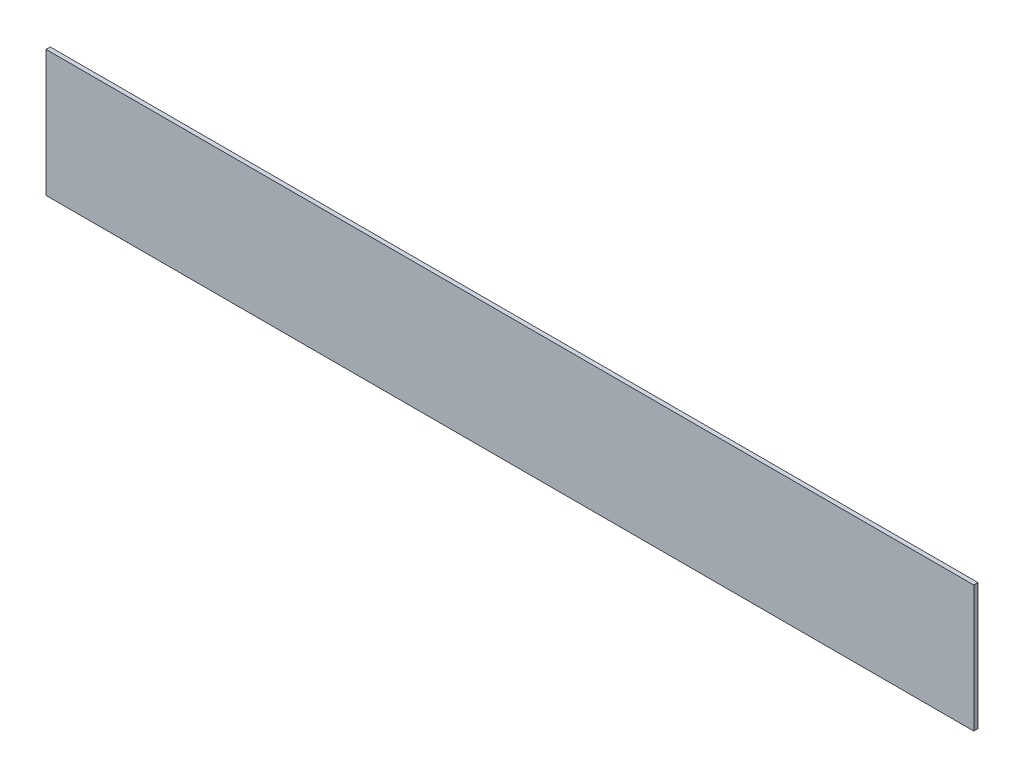
ISO-10303-21;
HEADER;
FILE_DESCRIPTION(('STEP AP214'),'2;1');
FILE_NAME('part.step','',(''),(''),'','','');
FILE_SCHEMA(('AUTOMOTIVE_DESIGN { 1 0 10303 214 1 1 1 1 }'));
ENDSEC;
DATA;
#1=APPLICATION_CONTEXT('core data for automotive mechanical design processes');
#2=APPLICATION_PROTOCOL_DEFINITION('international standard','automotive_design',2000,#1);
#3=PRODUCT_CONTEXT('',#1,'mechanical');
#4=PRODUCT('Part','Part','',(#3));
#5=PRODUCT_RELATED_PRODUCT_CATEGORY('part','',(#4));
#6=PRODUCT_DEFINITION_FORMATION('','',#4);
#7=PRODUCT_DEFINITION_CONTEXT('part definition',#1,'design');
#8=PRODUCT_DEFINITION('design','',#6,#7);
#9=PRODUCT_DEFINITION_SHAPE('','',#8);
#10=(LENGTH_UNIT() NAMED_UNIT(*) SI_UNIT(.MILLI.,.METRE.));
#11=(NAMED_UNIT(*) PLANE_ANGLE_UNIT() SI_UNIT($,.RADIAN.));
#12=(NAMED_UNIT(*) SI_UNIT($,.STERADIAN.) SOLID_ANGLE_UNIT());
#13=UNCERTAINTY_MEASURE_WITH_UNIT(LENGTH_MEASURE(1.E-05),#10,'distance_accuracy_value','');
#14=(GEOMETRIC_REPRESENTATION_CONTEXT(3) GLOBAL_UNCERTAINTY_ASSIGNED_CONTEXT((#13)) GLOBAL_UNIT_ASSIGNED_CONTEXT((#10,
#11,#12)) REPRESENTATION_CONTEXT('',''));
#15=CARTESIAN_POINT('',(0.,0.,0.));
#16=DIRECTION('',(0.,0.,1.));
#17=DIRECTION('',(1.,0.,0.));
#18=AXIS2_PLACEMENT_3D('',#15,#16,#17);
#19=CARTESIAN_POINT('',(0.,0.,2.54));
#20=DIRECTION('',(1.,0.,0.));
#21=DIRECTION('',(0.,0.,-1.));
#22=AXIS2_PLACEMENT_3D('',#19,#20,#21);
#23=PLANE('',#22);
#24=DIRECTION('',(0.,-1.,0.));
#25=VECTOR('',#24,1.);
#26=CARTESIAN_POINT('',(0.,0.,0.));
#27=LINE('',#26,#25);
#28=CARTESIAN_POINT('',(0.,76.2,0.));
#29=VERTEX_POINT('',#28);
#30=CARTESIAN_POINT('',(0.,0.,0.));
#31=VERTEX_POINT('',#30);
#32=EDGE_CURVE('E96',#29,#31,#27,.T.);
#33=ORIENTED_EDGE('',*,*,#32,.T.);
#34=DIRECTION('',(0.,0.,-1.));
#35=VECTOR('',#34,1.);
#36=CARTESIAN_POINT('',(0.,0.,2.54));
#37=LINE('',#36,#35);
#38=CARTESIAN_POINT('',(0.,0.,2.54));
#39=VERTEX_POINT('',#38);
#40=EDGE_CURVE('E11',#39,#31,#37,.T.);
#41=ORIENTED_EDGE('',*,*,#40,.F.);
#42=DIRECTION('',(0.,-1.,0.));
#43=VECTOR('',#42,1.);
#44=CARTESIAN_POINT('',(0.,0.,2.54));
#45=LINE('',#44,#43);
#46=CARTESIAN_POINT('',(0.,76.2,2.54));
#47=VERTEX_POINT('',#46);
#48=EDGE_CURVE('E84',#47,#39,#45,.T.);
#49=ORIENTED_EDGE('',*,*,#48,.F.);
#50=DIRECTION('',(0.,0.,-1.));
#51=VECTOR('',#50,1.);
#52=CARTESIAN_POINT('',(0.,76.2,2.54));
#53=LINE('',#52,#51);
#54=EDGE_CURVE('E92',#47,#29,#53,.T.);
#55=ORIENTED_EDGE('',*,*,#54,.T.);
#56=EDGE_LOOP('',(#33,#41,#49,#55));
#57=FACE_BOUND('',#56,.T.);
#58=ADVANCED_FACE('F33',(#57),#23,.F.);
#59=CARTESIAN_POINT('',(0.,0.,2.54));
#60=DIRECTION('',(0.,1.,0.));
#61=DIRECTION('',(0.,0.,1.));
#62=AXIS2_PLACEMENT_3D('',#59,#60,#61);
#63=PLANE('',#62);
#64=DIRECTION('',(1.,0.,0.));
#65=VECTOR('',#64,1.);
#66=CARTESIAN_POINT('',(0.,0.,0.));
#67=LINE('',#66,#65);
#68=CARTESIAN_POINT('',(558.8,0.,0.));
#69=VERTEX_POINT('',#68);
#70=EDGE_CURVE('E88',#31,#69,#67,.T.);
#71=ORIENTED_EDGE('',*,*,#70,.T.);
#72=DIRECTION('',(0.,0.,-1.));
#73=VECTOR('',#72,1.);
#74=CARTESIAN_POINT('',(558.8,0.,2.54));
#75=LINE('',#74,#73);
#76=CARTESIAN_POINT('',(558.8,0.,2.54));
#77=VERTEX_POINT('',#76);
#78=EDGE_CURVE('E41',#77,#69,#75,.T.);
#79=ORIENTED_EDGE('',*,*,#78,.F.);
#80=DIRECTION('',(1.,0.,0.));
#81=VECTOR('',#80,1.);
#82=CARTESIAN_POINT('',(0.,0.,2.54));
#83=LINE('',#82,#81);
#84=EDGE_CURVE('E79',#39,#77,#83,.T.);
#85=ORIENTED_EDGE('',*,*,#84,.F.);
#86=ORIENTED_EDGE('',*,*,#40,.T.);
#87=EDGE_LOOP('',(#71,#79,#85,#86));
#88=FACE_BOUND('',#87,.T.);
#89=ADVANCED_FACE('F87',(#88),#63,.F.);
#90=CARTESIAN_POINT('',(558.8,0.,2.54));
#91=DIRECTION('',(-1.,0.,0.));
#92=DIRECTION('',(0.,0.,1.));
#93=AXIS2_PLACEMENT_3D('',#90,#91,#92);
#94=PLANE('',#93);
#95=DIRECTION('',(0.,1.,0.));
#96=VECTOR('',#95,1.);
#97=CARTESIAN_POINT('',(558.8,0.,0.));
#98=LINE('',#97,#96);
#99=CARTESIAN_POINT('',(558.8,76.2,0.));
#100=VERTEX_POINT('',#99);
#101=EDGE_CURVE('E66',#69,#100,#98,.T.);
#102=ORIENTED_EDGE('',*,*,#101,.T.);
#103=DIRECTION('',(0.,0.,-1.));
#104=VECTOR('',#103,1.);
#105=CARTESIAN_POINT('',(558.8,76.2,2.54));
#106=LINE('',#105,#104);
#107=CARTESIAN_POINT('',(558.8,76.2,2.54));
#108=VERTEX_POINT('',#107);
#109=EDGE_CURVE('E89',#108,#100,#106,.T.);
#110=ORIENTED_EDGE('',*,*,#109,.F.);
#111=DIRECTION('',(0.,1.,0.));
#112=VECTOR('',#111,1.);
#113=CARTESIAN_POINT('',(558.8,0.,2.54));
#114=LINE('',#113,#112);
#115=EDGE_CURVE('E82',#77,#108,#114,.T.);
#116=ORIENTED_EDGE('',*,*,#115,.F.);
#117=ORIENTED_EDGE('',*,*,#78,.T.);
#118=EDGE_LOOP('',(#102,#110,#116,#117));
#119=FACE_BOUND('',#118,.T.);
#120=ADVANCED_FACE('F90',(#119),#94,.F.);
#121=CARTESIAN_POINT('',(0.,76.2,2.54));
#122=DIRECTION('',(0.,-1.,0.));
#123=DIRECTION('',(0.,0.,-1.));
#124=AXIS2_PLACEMENT_3D('',#121,#122,#123);
#125=PLANE('',#124);
#126=DIRECTION('',(-1.,0.,0.));
#127=VECTOR('',#126,1.);
#128=CARTESIAN_POINT('',(0.,76.2,0.));
#129=LINE('',#128,#127);
#130=EDGE_CURVE('E72',#100,#29,#129,.T.);
#131=ORIENTED_EDGE('',*,*,#130,.T.);
#132=ORIENTED_EDGE('',*,*,#54,.F.);
#133=DIRECTION('',(-1.,0.,0.));
#134=VECTOR('',#133,1.);
#135=CARTESIAN_POINT('',(0.,76.2,2.54));
#136=LINE('',#135,#134);
#137=EDGE_CURVE('E49',#108,#47,#136,.T.);
#138=ORIENTED_EDGE('',*,*,#137,.F.);
#139=ORIENTED_EDGE('',*,*,#109,.T.);
#140=EDGE_LOOP('',(#131,#132,#138,#139));
#141=FACE_BOUND('',#140,.T.);
#142=ADVANCED_FACE('F103',(#141),#125,.F.);
#143=CARTESIAN_POINT('',(0.,0.,2.54));
#144=DIRECTION('',(0.,0.,-1.));
#145=DIRECTION('',(-1.,0.,0.));
#146=AXIS2_PLACEMENT_3D('',#143,#144,#145);
#147=PLANE('',#146);
#148=ORIENTED_EDGE('',*,*,#48,.T.);
#149=ORIENTED_EDGE('',*,*,#84,.T.);
#150=ORIENTED_EDGE('',*,*,#115,.T.);
#151=ORIENTED_EDGE('',*,*,#137,.T.);
#152=EDGE_LOOP('',(#148,#149,#150,#151));
#153=FACE_BOUND('',#152,.T.);
#154=ADVANCED_FACE('F80',(#153),#147,.F.);
#155=CARTESIAN_POINT('',(0.,0.,0.));
#156=DIRECTION('',(0.,0.,-1.));
#157=DIRECTION('',(-1.,0.,0.));
#158=AXIS2_PLACEMENT_3D('',#155,#156,#157);
#159=PLANE('',#158);
#160=ORIENTED_EDGE('',*,*,#32,.F.);
#161=ORIENTED_EDGE('',*,*,#130,.F.);
#162=ORIENTED_EDGE('',*,*,#101,.F.);
#163=ORIENTED_EDGE('',*,*,#70,.F.);
#164=EDGE_LOOP('',(#160,#161,#162,#163));
#165=FACE_BOUND('',#164,.T.);
#166=ADVANCED_FACE('F106',(#165),#159,.T.);
#167=CLOSED_SHELL('',(#58,#89,#120,#142,#154,#166));
#168=MANIFOLD_SOLID_BREP('B2',#167);
#169=ADVANCED_BREP_SHAPE_REPRESENTATION('',(#18,#168),#14);
#170=SHAPE_DEFINITION_REPRESENTATION(#9,#169);
ENDSEC;
END-ISO-10303-21;
